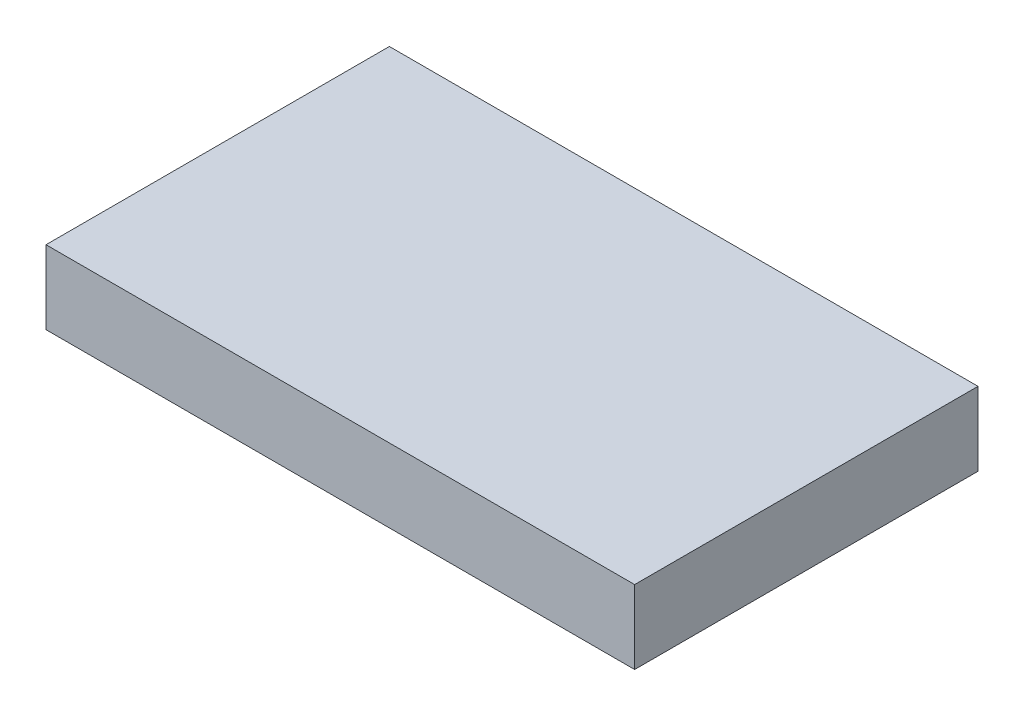
ISO-10303-21;
HEADER;
FILE_DESCRIPTION(('STEP AP214'),'2;1');
FILE_NAME('part.step','',(''),(''),'','','');
FILE_SCHEMA(('AUTOMOTIVE_DESIGN { 1 0 10303 214 1 1 1 1 }'));
ENDSEC;
DATA;
#1=APPLICATION_CONTEXT('core data for automotive mechanical design processes');
#2=APPLICATION_PROTOCOL_DEFINITION('international standard','automotive_design',2000,#1);
#3=PRODUCT_CONTEXT('',#1,'mechanical');
#4=PRODUCT('Part','Part','',(#3));
#5=PRODUCT_RELATED_PRODUCT_CATEGORY('part','',(#4));
#6=PRODUCT_DEFINITION_FORMATION('','',#4);
#7=PRODUCT_DEFINITION_CONTEXT('part definition',#1,'design');
#8=PRODUCT_DEFINITION('design','',#6,#7);
#9=PRODUCT_DEFINITION_SHAPE('','',#8);
#10=(LENGTH_UNIT() NAMED_UNIT(*) SI_UNIT(.MILLI.,.METRE.));
#11=(NAMED_UNIT(*) PLANE_ANGLE_UNIT() SI_UNIT($,.RADIAN.));
#12=(NAMED_UNIT(*) SI_UNIT($,.STERADIAN.) SOLID_ANGLE_UNIT());
#13=UNCERTAINTY_MEASURE_WITH_UNIT(LENGTH_MEASURE(1.E-05),#10,'distance_accuracy_value','');
#14=(GEOMETRIC_REPRESENTATION_CONTEXT(3) GLOBAL_UNCERTAINTY_ASSIGNED_CONTEXT((#13)) GLOBAL_UNIT_ASSIGNED_CONTEXT((#10,
#11,#12)) REPRESENTATION_CONTEXT('',''));
#15=CARTESIAN_POINT('',(0.,0.,0.));
#16=DIRECTION('',(0.,0.,1.));
#17=DIRECTION('',(1.,0.,0.));
#18=AXIS2_PLACEMENT_3D('',#15,#16,#17);
#19=CARTESIAN_POINT('',(-29.080631276901,7.62,-17.8492395982783));
#20=DIRECTION('',(1.,0.,0.));
#21=DIRECTION('',(0.,0.,-1.));
#22=AXIS2_PLACEMENT_3D('',#19,#20,#21);
#23=PLANE('',#22);
#24=DIRECTION('',(0.,0.,1.));
#25=VECTOR('',#24,1.);
#26=CARTESIAN_POINT('',(-29.080631276901,0.,-17.8492395982783));
#27=LINE('',#26,#25);
#28=CARTESIAN_POINT('',(-29.080631276901,0.,-17.8492395982783));
#29=VERTEX_POINT('',#28);
#30=CARTESIAN_POINT('',(-29.080631276901,0.,17.7107604017217));
#31=VERTEX_POINT('',#30);
#32=EDGE_CURVE('E107',#29,#31,#27,.T.);
#33=ORIENTED_EDGE('',*,*,#32,.T.);
#34=DIRECTION('',(0.,-1.,0.));
#35=VECTOR('',#34,1.);
#36=CARTESIAN_POINT('',(-29.080631276901,7.62,17.7107604017217));
#37=LINE('',#36,#35);
#38=CARTESIAN_POINT('',(-29.080631276901,7.62,17.7107604017217));
#39=VERTEX_POINT('',#38);
#40=EDGE_CURVE('E11',#39,#31,#37,.T.);
#41=ORIENTED_EDGE('',*,*,#40,.F.);
#42=DIRECTION('',(0.,0.,1.));
#43=VECTOR('',#42,1.);
#44=CARTESIAN_POINT('',(-29.080631276901,7.62,-17.8492395982783));
#45=LINE('',#44,#43);
#46=CARTESIAN_POINT('',(-29.080631276901,7.62,-17.8492395982783));
#47=VERTEX_POINT('',#46);
#48=EDGE_CURVE('E91',#47,#39,#45,.T.);
#49=ORIENTED_EDGE('',*,*,#48,.F.);
#50=DIRECTION('',(0.,-1.,0.));
#51=VECTOR('',#50,1.);
#52=CARTESIAN_POINT('',(-29.080631276901,7.62,-17.8492395982783));
#53=LINE('',#52,#51);
#54=EDGE_CURVE('E103',#47,#29,#53,.T.);
#55=ORIENTED_EDGE('',*,*,#54,.T.);
#56=EDGE_LOOP('',(#33,#41,#49,#55));
#57=FACE_BOUND('',#56,.T.);
#58=ADVANCED_FACE('F39',(#57),#23,.F.);
#59=CARTESIAN_POINT('',(-29.080631276901,7.62,17.7107604017217));
#60=DIRECTION('',(0.,0.,-1.));
#61=DIRECTION('',(-1.,0.,0.));
#62=AXIS2_PLACEMENT_3D('',#59,#60,#61);
#63=PLANE('',#62);
#64=DIRECTION('',(1.,0.,0.));
#65=VECTOR('',#64,1.);
#66=CARTESIAN_POINT('',(-29.080631276901,0.,17.7107604017217));
#67=LINE('',#66,#65);
#68=CARTESIAN_POINT('',(31.879368723099,0.,17.7107604017217));
#69=VERTEX_POINT('',#68);
#70=EDGE_CURVE('E96',#31,#69,#67,.T.);
#71=ORIENTED_EDGE('',*,*,#70,.T.);
#72=DIRECTION('',(0.,-1.,0.));
#73=VECTOR('',#72,1.);
#74=CARTESIAN_POINT('',(31.879368723099,7.62,17.7107604017217));
#75=LINE('',#74,#73);
#76=CARTESIAN_POINT('',(31.879368723099,7.62,17.7107604017217));
#77=VERTEX_POINT('',#76);
#78=EDGE_CURVE('E48',#77,#69,#75,.T.);
#79=ORIENTED_EDGE('',*,*,#78,.F.);
#80=DIRECTION('',(1.,0.,0.));
#81=VECTOR('',#80,1.);
#82=CARTESIAN_POINT('',(-29.080631276901,7.62,17.7107604017217));
#83=LINE('',#82,#81);
#84=EDGE_CURVE('E86',#39,#77,#83,.T.);
#85=ORIENTED_EDGE('',*,*,#84,.F.);
#86=ORIENTED_EDGE('',*,*,#40,.T.);
#87=EDGE_LOOP('',(#71,#79,#85,#86));
#88=FACE_BOUND('',#87,.T.);
#89=ADVANCED_FACE('F95',(#88),#63,.F.);
#90=CARTESIAN_POINT('',(31.879368723099,7.62,-17.8492395982783));
#91=DIRECTION('',(-1.,0.,0.));
#92=DIRECTION('',(0.,0.,1.));
#93=AXIS2_PLACEMENT_3D('',#90,#91,#92);
#94=PLANE('',#93);
#95=DIRECTION('',(0.,0.,-1.));
#96=VECTOR('',#95,1.);
#97=CARTESIAN_POINT('',(31.879368723099,0.,-17.8492395982783));
#98=LINE('',#97,#96);
#99=CARTESIAN_POINT('',(31.879368723099,0.,-17.8492395982783));
#100=VERTEX_POINT('',#99);
#101=EDGE_CURVE('E73',#69,#100,#98,.T.);
#102=ORIENTED_EDGE('',*,*,#101,.T.);
#103=DIRECTION('',(0.,-1.,0.));
#104=VECTOR('',#103,1.);
#105=CARTESIAN_POINT('',(31.879368723099,7.62,-17.8492395982783));
#106=LINE('',#105,#104);
#107=CARTESIAN_POINT('',(31.879368723099,7.62,-17.8492395982783));
#108=VERTEX_POINT('',#107);
#109=EDGE_CURVE('E98',#108,#100,#106,.T.);
#110=ORIENTED_EDGE('',*,*,#109,.F.);
#111=DIRECTION('',(0.,0.,-1.));
#112=VECTOR('',#111,1.);
#113=CARTESIAN_POINT('',(31.879368723099,7.62,-17.8492395982783));
#114=LINE('',#113,#112);
#115=EDGE_CURVE('E89',#77,#108,#114,.T.);
#116=ORIENTED_EDGE('',*,*,#115,.F.);
#117=ORIENTED_EDGE('',*,*,#78,.T.);
#118=EDGE_LOOP('',(#102,#110,#116,#117));
#119=FACE_BOUND('',#118,.T.);
#120=ADVANCED_FACE('F99',(#119),#94,.F.);
#121=CARTESIAN_POINT('',(-29.080631276901,7.62,-17.8492395982783));
#122=DIRECTION('',(0.,0.,1.));
#123=DIRECTION('',(1.,0.,0.));
#124=AXIS2_PLACEMENT_3D('',#121,#122,#123);
#125=PLANE('',#124);
#126=DIRECTION('',(-1.,0.,0.));
#127=VECTOR('',#126,1.);
#128=CARTESIAN_POINT('',(-29.080631276901,0.,-17.8492395982783));
#129=LINE('',#128,#127);
#130=EDGE_CURVE('E79',#100,#29,#129,.T.);
#131=ORIENTED_EDGE('',*,*,#130,.T.);
#132=ORIENTED_EDGE('',*,*,#54,.F.);
#133=DIRECTION('',(-1.,0.,0.));
#134=VECTOR('',#133,1.);
#135=CARTESIAN_POINT('',(-29.080631276901,7.62,-17.8492395982783));
#136=LINE('',#135,#134);
#137=EDGE_CURVE('E56',#108,#47,#136,.T.);
#138=ORIENTED_EDGE('',*,*,#137,.F.);
#139=ORIENTED_EDGE('',*,*,#109,.T.);
#140=EDGE_LOOP('',(#131,#132,#138,#139));
#141=FACE_BOUND('',#140,.T.);
#142=ADVANCED_FACE('F120',(#141),#125,.F.);
#143=CARTESIAN_POINT('',(0.,7.62,0.));
#144=DIRECTION('',(0.,1.,0.));
#145=DIRECTION('',(0.,0.,1.));
#146=AXIS2_PLACEMENT_3D('',#143,#144,#145);
#147=PLANE('',#146);
#148=ORIENTED_EDGE('',*,*,#48,.T.);
#149=ORIENTED_EDGE('',*,*,#84,.T.);
#150=ORIENTED_EDGE('',*,*,#115,.T.);
#151=ORIENTED_EDGE('',*,*,#137,.T.);
#152=EDGE_LOOP('',(#148,#149,#150,#151));
#153=FACE_BOUND('',#152,.T.);
#154=ADVANCED_FACE('F87',(#153),#147,.T.);
#155=CARTESIAN_POINT('',(0.,0.,0.));
#156=DIRECTION('',(0.,1.,0.));
#157=DIRECTION('',(0.,0.,1.));
#158=AXIS2_PLACEMENT_3D('',#155,#156,#157);
#159=PLANE('',#158);
#160=ORIENTED_EDGE('',*,*,#32,.F.);
#161=ORIENTED_EDGE('',*,*,#130,.F.);
#162=ORIENTED_EDGE('',*,*,#101,.F.);
#163=ORIENTED_EDGE('',*,*,#70,.F.);
#164=EDGE_LOOP('',(#160,#161,#162,#163));
#165=FACE_BOUND('',#164,.T.);
#166=ADVANCED_FACE('F123',(#165),#159,.F.);
#167=CLOSED_SHELL('',(#58,#89,#120,#142,#154,#166));
#168=MANIFOLD_SOLID_BREP('B2',#167);
#169=ADVANCED_BREP_SHAPE_REPRESENTATION('',(#18,#168),#14);
#170=SHAPE_DEFINITION_REPRESENTATION(#9,#169);
ENDSEC;
END-ISO-10303-21;
